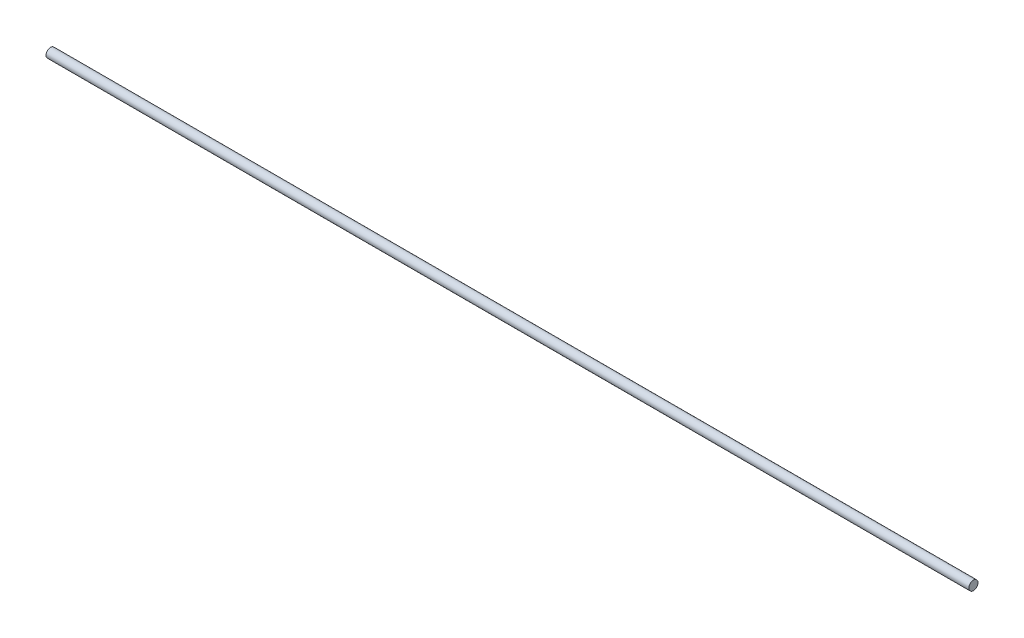
ISO-10303-21;
HEADER;
FILE_DESCRIPTION(('STEP AP214'),'2;1');
FILE_NAME('part.step','',(''),(''),'','','');
FILE_SCHEMA(('AUTOMOTIVE_DESIGN { 1 0 10303 214 1 1 1 1 }'));
ENDSEC;
DATA;
#1=APPLICATION_CONTEXT('core data for automotive mechanical design processes');
#2=APPLICATION_PROTOCOL_DEFINITION('international standard','automotive_design',2000,#1);
#3=PRODUCT_CONTEXT('',#1,'mechanical');
#4=PRODUCT('Part','Part','',(#3));
#5=PRODUCT_RELATED_PRODUCT_CATEGORY('part','',(#4));
#6=PRODUCT_DEFINITION_FORMATION('','',#4);
#7=PRODUCT_DEFINITION_CONTEXT('part definition',#1,'design');
#8=PRODUCT_DEFINITION('design','',#6,#7);
#9=PRODUCT_DEFINITION_SHAPE('','',#8);
#10=(LENGTH_UNIT() NAMED_UNIT(*) SI_UNIT(.MILLI.,.METRE.));
#11=(NAMED_UNIT(*) PLANE_ANGLE_UNIT() SI_UNIT($,.RADIAN.));
#12=(NAMED_UNIT(*) SI_UNIT($,.STERADIAN.) SOLID_ANGLE_UNIT());
#13=UNCERTAINTY_MEASURE_WITH_UNIT(LENGTH_MEASURE(1.E-05),#10,'distance_accuracy_value','');
#14=(GEOMETRIC_REPRESENTATION_CONTEXT(3) GLOBAL_UNCERTAINTY_ASSIGNED_CONTEXT((#13)) GLOBAL_UNIT_ASSIGNED_CONTEXT((#10,
#11,#12)) REPRESENTATION_CONTEXT('',''));
#15=CARTESIAN_POINT('',(0.,0.,0.));
#16=DIRECTION('',(0.,0.,1.));
#17=DIRECTION('',(1.,0.,0.));
#18=AXIS2_PLACEMENT_3D('',#15,#16,#17);
#19=CARTESIAN_POINT('',(0.,0.,0.));
#20=DIRECTION('',(1.,0.,0.));
#21=DIRECTION('',(0.,0.,-1.));
#22=AXIS2_PLACEMENT_3D('',#19,#20,#21);
#23=PLANE('',#22);
#24=CARTESIAN_POINT('',(0.,0.,0.));
#25=DIRECTION('',(1.,0.,0.));
#26=DIRECTION('',(0.,0.,-1.));
#27=AXIS2_PLACEMENT_3D('',#24,#25,#26);
#28=CIRCLE('',#27,3.96875);
#29=CARTESIAN_POINT('',(0.,0.,-3.96875));
#30=VERTEX_POINT('',#29);
#31=EDGE_CURVE('E40',#30,#30,#28,.T.);
#32=ORIENTED_EDGE('',*,*,#31,.F.);
#33=EDGE_LOOP('',(#32));
#34=FACE_BOUND('',#33,.T.);
#35=ADVANCED_FACE('F33',(#34),#23,.F.);
#36=CARTESIAN_POINT('',(821.225320151336,0.,0.));
#37=DIRECTION('',(-1.,0.,0.));
#38=DIRECTION('',(0.,0.,1.));
#39=AXIS2_PLACEMENT_3D('',#36,#37,#38);
#40=CYLINDRICAL_SURFACE('',#39,3.96875);
#41=CARTESIAN_POINT('',(800.,0.,0.));
#42=DIRECTION('',(-1.,0.,0.));
#43=DIRECTION('',(0.,0.,1.));
#44=AXIS2_PLACEMENT_3D('',#41,#42,#43);
#45=CIRCLE('',#44,3.96875);
#46=CARTESIAN_POINT('',(800.,0.,3.96875));
#47=VERTEX_POINT('',#46);
#48=EDGE_CURVE('E10',#47,#47,#45,.T.);
#49=ORIENTED_EDGE('',*,*,#48,.T.);
#50=EDGE_LOOP('',(#49));
#51=FACE_BOUND('',#50,.T.);
#52=ORIENTED_EDGE('',*,*,#31,.T.);
#53=EDGE_LOOP('',(#52));
#54=FACE_BOUND('',#53,.T.);
#55=ADVANCED_FACE('F35',(#51,#54),#40,.T.);
#56=CARTESIAN_POINT('',(800.,409.969537041224,-364.999999999999));
#57=DIRECTION('',(-1.,0.,0.));
#58=DIRECTION('',(0.,0.,1.));
#59=AXIS2_PLACEMENT_3D('',#56,#57,#58);
#60=PLANE('',#59);
#61=ORIENTED_EDGE('',*,*,#48,.F.);
#62=EDGE_LOOP('',(#61));
#63=FACE_BOUND('',#62,.T.);
#64=ADVANCED_FACE('F51',(#63),#60,.F.);
#65=CLOSED_SHELL('',(#35,#55,#64));
#66=MANIFOLD_SOLID_BREP('B2',#65);
#67=ADVANCED_BREP_SHAPE_REPRESENTATION('',(#18,#66),#14);
#68=SHAPE_DEFINITION_REPRESENTATION(#9,#67);
ENDSEC;
END-ISO-10303-21;
